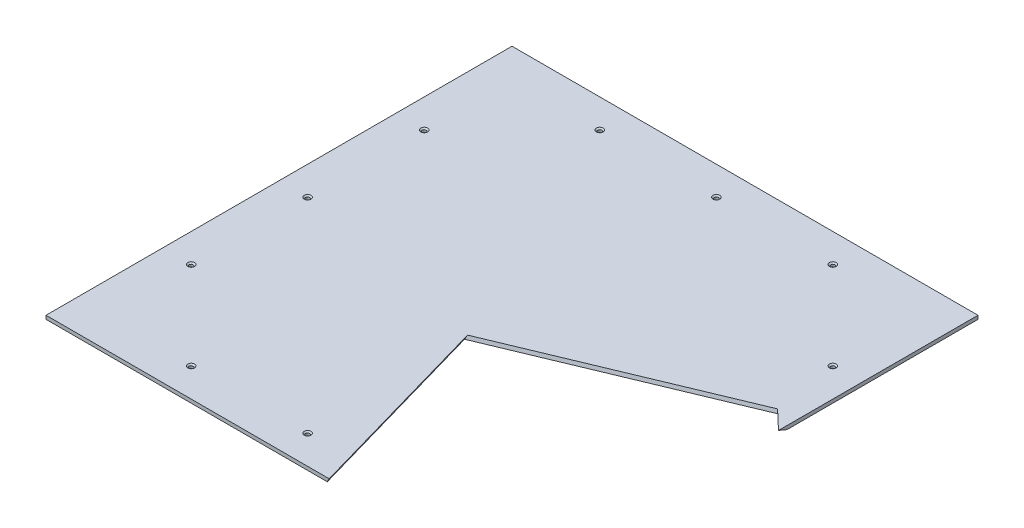
ISO-10303-21;
HEADER;
FILE_DESCRIPTION(('STEP AP214'),'2;1');
FILE_NAME('part.step','',(''),(''),'','','');
FILE_SCHEMA(('AUTOMOTIVE_DESIGN { 1 0 10303 214 1 1 1 1 }'));
ENDSEC;
DATA;
#1=APPLICATION_CONTEXT('core data for automotive mechanical design processes');
#2=APPLICATION_PROTOCOL_DEFINITION('international standard','automotive_design',2000,#1);
#3=PRODUCT_CONTEXT('',#1,'mechanical');
#4=PRODUCT('Part','Part','',(#3));
#5=PRODUCT_RELATED_PRODUCT_CATEGORY('part','',(#4));
#6=PRODUCT_DEFINITION_FORMATION('','',#4);
#7=PRODUCT_DEFINITION_CONTEXT('part definition',#1,'design');
#8=PRODUCT_DEFINITION('design','',#6,#7);
#9=PRODUCT_DEFINITION_SHAPE('','',#8);
#10=(LENGTH_UNIT() NAMED_UNIT(*) SI_UNIT(.MILLI.,.METRE.));
#11=(NAMED_UNIT(*) PLANE_ANGLE_UNIT() SI_UNIT($,.RADIAN.));
#12=(NAMED_UNIT(*) SI_UNIT($,.STERADIAN.) SOLID_ANGLE_UNIT());
#13=UNCERTAINTY_MEASURE_WITH_UNIT(LENGTH_MEASURE(1.E-05),#10,'distance_accuracy_value','');
#14=(GEOMETRIC_REPRESENTATION_CONTEXT(3) GLOBAL_UNCERTAINTY_ASSIGNED_CONTEXT((#13)) GLOBAL_UNIT_ASSIGNED_CONTEXT((#10,
#11,#12)) REPRESENTATION_CONTEXT('',''));
#15=CARTESIAN_POINT('',(0.,0.,0.));
#16=DIRECTION('',(0.,0.,1.));
#17=DIRECTION('',(1.,0.,0.));
#18=AXIS2_PLACEMENT_3D('',#15,#16,#17);
#19=CARTESIAN_POINT('',(103.375714,114.488214,103.375714));
#20=DIRECTION('',(0.,0.,1.));
#21=DIRECTION('',(-1.,0.,0.));
#22=AXIS2_PLACEMENT_3D('',#19,#20,#21);
#23=PLANE('',#22);
#24=DIRECTION('',(-1.,0.,0.));
#25=VECTOR('',#24,1.);
#26=CARTESIAN_POINT('',(103.375714,112.900714,103.375714));
#27=LINE('',#26,#25);
#28=CARTESIAN_POINT('',(21.4309861306069,112.900714,103.375714));
#29=VERTEX_POINT('',#28);
#30=CARTESIAN_POINT('',(-103.375714,112.900714,103.375714));
#31=VERTEX_POINT('',#30);
#32=EDGE_CURVE('E131',#29,#31,#27,.T.);
#33=ORIENTED_EDGE('',*,*,#32,.F.);
#34=DIRECTION('',(0.460037507323201,0.887899482968571,0.));
#35=VECTOR('',#34,1.);
#36=CARTESIAN_POINT('',(39.4217597737779,147.623966695032,103.375714));
#37=LINE('',#36,#35);
#38=CARTESIAN_POINT('',(22.2534998913244,114.488214,103.375714));
#39=VERTEX_POINT('',#38);
#40=EDGE_CURVE('E47',#29,#39,#37,.T.);
#41=ORIENTED_EDGE('',*,*,#40,.T.);
#42=DIRECTION('',(-1.,0.,0.));
#43=VECTOR('',#42,1.);
#44=CARTESIAN_POINT('',(103.375714,114.488214,103.375714));
#45=LINE('',#44,#43);
#46=CARTESIAN_POINT('',(-103.375714,114.488214,103.375714));
#47=VERTEX_POINT('',#46);
#48=EDGE_CURVE('E77',#39,#47,#45,.T.);
#49=ORIENTED_EDGE('',*,*,#48,.T.);
#50=DIRECTION('',(0.,-1.,0.));
#51=VECTOR('',#50,1.);
#52=CARTESIAN_POINT('',(-103.375714,114.488214,103.375714));
#53=LINE('',#52,#51);
#54=EDGE_CURVE('E118',#47,#31,#53,.T.);
#55=ORIENTED_EDGE('',*,*,#54,.T.);
#56=EDGE_LOOP('',(#33,#41,#49,#55));
#57=FACE_BOUND('',#56,.T.);
#58=ADVANCED_FACE('F32',(#57),#23,.T.);
#59=CARTESIAN_POINT('',(103.375714,114.488214,103.375714));
#60=DIRECTION('',(1.,0.,0.));
#61=DIRECTION('',(0.,0.,1.));
#62=AXIS2_PLACEMENT_3D('',#59,#60,#61);
#63=PLANE('',#62);
#64=DIRECTION('',(0.,0.386214206739789,0.922409121004533));
#65=VECTOR('',#64,1.);
#66=CARTESIAN_POINT('',(103.375714,156.608835220611,85.7397410443235));
#67=LINE('',#66,#65);
#68=CARTESIAN_POINT('',(103.375714,112.900714,-18.6499188187758));
#69=VERTEX_POINT('',#68);
#70=CARTESIAN_POINT('',(103.375714,114.488214,-14.8584361284943));
#71=VERTEX_POINT('',#70);
#72=EDGE_CURVE('E224',#69,#71,#67,.T.);
#73=ORIENTED_EDGE('',*,*,#72,.F.);
#74=DIRECTION('',(0.,0.,1.));
#75=VECTOR('',#74,1.);
#76=CARTESIAN_POINT('',(103.375714,112.900714,103.375714));
#77=LINE('',#76,#75);
#78=CARTESIAN_POINT('',(103.375714,112.900714,-103.375714));
#79=VERTEX_POINT('',#78);
#80=EDGE_CURVE('E133',#79,#69,#77,.T.);
#81=ORIENTED_EDGE('',*,*,#80,.F.);
#82=DIRECTION('',(0.,-1.,0.));
#83=VECTOR('',#82,1.);
#84=CARTESIAN_POINT('',(103.375714,114.488214,-103.375714));
#85=LINE('',#84,#83);
#86=CARTESIAN_POINT('',(103.375714,114.488214,-103.375714));
#87=VERTEX_POINT('',#86);
#88=EDGE_CURVE('E56',#87,#79,#85,.T.);
#89=ORIENTED_EDGE('',*,*,#88,.F.);
#90=DIRECTION('',(0.,0.,1.));
#91=VECTOR('',#90,1.);
#92=CARTESIAN_POINT('',(103.375714,114.488214,103.375714));
#93=LINE('',#92,#91);
#94=EDGE_CURVE('E127',#87,#71,#93,.T.);
#95=ORIENTED_EDGE('',*,*,#94,.T.);
#96=EDGE_LOOP('',(#73,#81,#89,#95));
#97=FACE_BOUND('',#96,.T.);
#98=ADVANCED_FACE('F34',(#97),#63,.T.);
#99=CARTESIAN_POINT('',(103.375714,114.488214,-103.375714));
#100=DIRECTION('',(0.,0.,-1.));
#101=DIRECTION('',(1.,0.,0.));
#102=AXIS2_PLACEMENT_3D('',#99,#100,#101);
#103=PLANE('',#102);
#104=DIRECTION('',(1.,0.,0.));
#105=VECTOR('',#104,1.);
#106=CARTESIAN_POINT('',(103.375714,112.900714,-103.375714));
#107=LINE('',#106,#105);
#108=CARTESIAN_POINT('',(-103.375714,112.900714,-103.375714));
#109=VERTEX_POINT('',#108);
#110=EDGE_CURVE('E124',#109,#79,#107,.T.);
#111=ORIENTED_EDGE('',*,*,#110,.F.);
#112=DIRECTION('',(0.,-1.,0.));
#113=VECTOR('',#112,1.);
#114=CARTESIAN_POINT('',(-103.375714,114.488214,-103.375714));
#115=LINE('',#114,#113);
#116=CARTESIAN_POINT('',(-103.375714,114.488214,-103.375714));
#117=VERTEX_POINT('',#116);
#118=EDGE_CURVE('E120',#117,#109,#115,.T.);
#119=ORIENTED_EDGE('',*,*,#118,.F.);
#120=DIRECTION('',(1.,0.,0.));
#121=VECTOR('',#120,1.);
#122=CARTESIAN_POINT('',(103.375714,114.488214,-103.375714));
#123=LINE('',#122,#121);
#124=EDGE_CURVE('E121',#117,#87,#123,.T.);
#125=ORIENTED_EDGE('',*,*,#124,.T.);
#126=ORIENTED_EDGE('',*,*,#88,.T.);
#127=EDGE_LOOP('',(#111,#119,#125,#126));
#128=FACE_BOUND('',#127,.T.);
#129=ADVANCED_FACE('F240',(#128),#103,.T.);
#130=CARTESIAN_POINT('',(-103.375714,114.488214,103.375714));
#131=DIRECTION('',(-1.,0.,0.));
#132=DIRECTION('',(0.,0.,-1.));
#133=AXIS2_PLACEMENT_3D('',#130,#131,#132);
#134=PLANE('',#133);
#135=DIRECTION('',(0.,0.,-1.));
#136=VECTOR('',#135,1.);
#137=CARTESIAN_POINT('',(-103.375714,112.900714,103.375714));
#138=LINE('',#137,#136);
#139=EDGE_CURVE('E128',#31,#109,#138,.T.);
#140=ORIENTED_EDGE('',*,*,#139,.F.);
#141=ORIENTED_EDGE('',*,*,#54,.F.);
#142=DIRECTION('',(0.,0.,-1.));
#143=VECTOR('',#142,1.);
#144=CARTESIAN_POINT('',(-103.375714,114.488214,103.375714));
#145=LINE('',#144,#143);
#146=EDGE_CURVE('E137',#47,#117,#145,.T.);
#147=ORIENTED_EDGE('',*,*,#146,.T.);
#148=ORIENTED_EDGE('',*,*,#118,.T.);
#149=EDGE_LOOP('',(#140,#141,#147,#148));
#150=FACE_BOUND('',#149,.T.);
#151=ADVANCED_FACE('F242',(#150),#134,.T.);
#152=CARTESIAN_POINT('',(103.375714,114.488214,-103.375714));
#153=DIRECTION('',(0.,1.,0.));
#154=DIRECTION('',(0.,0.,-1.));
#155=AXIS2_PLACEMENT_3D('',#152,#153,#154);
#156=PLANE('',#155);
#157=DIRECTION('',(-0.72421998556321,0.,-0.689569004894234));
#158=VECTOR('',#157,1.);
#159=CARTESIAN_POINT('',(59.1702159898484,114.488214,-56.9488808571199));
#160=LINE('',#159,#158);
#161=CARTESIAN_POINT('',(94.8909827444984,114.488214,-22.9372075036051));
#162=VERTEX_POINT('',#161);
#163=EDGE_CURVE('E222',#71,#162,#160,.T.);
#164=ORIENTED_EDGE('',*,*,#163,.F.);
#165=ORIENTED_EDGE('',*,*,#94,.F.);
#166=ORIENTED_EDGE('',*,*,#124,.F.);
#167=ORIENTED_EDGE('',*,*,#146,.F.);
#168=ORIENTED_EDGE('',*,*,#48,.F.);
#169=DIRECTION('',(-0.274341876899344,0.,-0.961632224178945));
#170=VECTOR('',#169,1.);
#171=CARTESIAN_POINT('',(-26.1852936626815,114.488214,-66.4135478813487));
#172=LINE('',#171,#170);
#173=CARTESIAN_POINT('',(-2.24691045077545,114.488214,17.4960650129276));
#174=VERTEX_POINT('',#173);
#175=EDGE_CURVE('E227',#39,#174,#172,.T.);
#176=ORIENTED_EDGE('',*,*,#175,.T.);
#177=DIRECTION('',(-0.923214701144147,0.,0.384284550289657));
#178=VECTOR('',#177,1.);
#179=CARTESIAN_POINT('',(130.660478356849,114.488214,-37.8261217707252));
#180=LINE('',#179,#178);
#181=EDGE_CURVE('E112',#162,#174,#180,.T.);
#182=ORIENTED_EDGE('',*,*,#181,.F.);
#183=EDGE_LOOP('',(#164,#165,#166,#167,#168,#176,#182));
#184=FACE_BOUND('',#183,.T.);
#185=CARTESIAN_POINT('',(-90.6757140000005,114.488214,51.6878569999991));
#186=DIRECTION('',(0.,1.,0.));
#187=DIRECTION('',(0.,0.,-1.));
#188=AXIS2_PLACEMENT_3D('',#185,#186,#187);
#189=CIRCLE('',#188,1.51130000000001);
#190=CARTESIAN_POINT('',(-90.6757140000005,114.488214,50.1765569999991));
#191=VERTEX_POINT('',#190);
#192=EDGE_CURVE('E219',#191,#191,#189,.T.);
#193=ORIENTED_EDGE('',*,*,#192,.F.);
#194=EDGE_LOOP('',(#193));
#195=FACE_BOUND('',#194,.T.);
#196=CARTESIAN_POINT('',(-90.675714,114.488214,-9.36190769008373E-13));
#197=DIRECTION('',(0.,1.,0.));
#198=DIRECTION('',(0.,0.,-1.));
#199=AXIS2_PLACEMENT_3D('',#196,#197,#198);
#200=CIRCLE('',#199,1.51129999999999);
#201=CARTESIAN_POINT('',(-90.675714,114.488214,-1.51130000000093));
#202=VERTEX_POINT('',#201);
#203=EDGE_CURVE('E210',#202,#202,#200,.T.);
#204=ORIENTED_EDGE('',*,*,#203,.F.);
#205=EDGE_LOOP('',(#204));
#206=FACE_BOUND('',#205,.T.);
#207=CARTESIAN_POINT('',(-90.6757139999995,114.488214,-51.687857000001));
#208=DIRECTION('',(0.,1.,0.));
#209=DIRECTION('',(0.,0.,-1.));
#210=AXIS2_PLACEMENT_3D('',#207,#208,#209);
#211=CIRCLE('',#210,1.51129999999999);
#212=CARTESIAN_POINT('',(-90.6757139999995,114.488214,-53.1991570000009));
#213=VERTEX_POINT('',#212);
#214=EDGE_CURVE('E201',#213,#213,#211,.T.);
#215=ORIENTED_EDGE('',*,*,#214,.F.);
#216=EDGE_LOOP('',(#215));
#217=FACE_BOUND('',#216,.T.);
#218=CARTESIAN_POINT('',(-6.1959802232066E-13,114.488214,90.675714));
#219=DIRECTION('',(0.,1.,0.));
#220=DIRECTION('',(0.,0.,-1.));
#221=AXIS2_PLACEMENT_3D('',#218,#219,#220);
#222=CIRCLE('',#221,1.5113);
#223=CARTESIAN_POINT('',(-6.1959802232066E-13,114.488214,89.164414));
#224=VERTEX_POINT('',#223);
#225=EDGE_CURVE('E192',#224,#224,#222,.T.);
#226=ORIENTED_EDGE('',*,*,#225,.F.);
#227=EDGE_LOOP('',(#226));
#228=FACE_BOUND('',#227,.T.);
#229=CARTESIAN_POINT('',(-51.6878570000006,114.488214,90.6757139999997));
#230=DIRECTION('',(0.,1.,0.));
#231=DIRECTION('',(0.,0.,-1.));
#232=AXIS2_PLACEMENT_3D('',#229,#230,#231);
#233=CIRCLE('',#232,1.5113);
#234=CARTESIAN_POINT('',(-51.6878570000006,114.488214,89.1644139999997));
#235=VERTEX_POINT('',#234);
#236=EDGE_CURVE('E183',#235,#235,#233,.T.);
#237=ORIENTED_EDGE('',*,*,#236,.F.);
#238=EDGE_LOOP('',(#237));
#239=FACE_BOUND('',#238,.T.);
#240=CARTESIAN_POINT('',(90.6757140000002,114.488214,-51.6878569999997));
#241=DIRECTION('',(0.,1.,0.));
#242=DIRECTION('',(0.,0.,-1.));
#243=AXIS2_PLACEMENT_3D('',#240,#241,#242);
#244=CIRCLE('',#243,1.51130000000001);
#245=CARTESIAN_POINT('',(90.6757140000002,114.488214,-53.1991569999997));
#246=VERTEX_POINT('',#245);
#247=EDGE_CURVE('E174',#246,#246,#244,.T.);
#248=ORIENTED_EDGE('',*,*,#247,.F.);
#249=EDGE_LOOP('',(#248));
#250=FACE_BOUND('',#249,.T.);
#251=CARTESIAN_POINT('',(-51.687857,114.488214,-90.675714));
#252=DIRECTION('',(0.,1.,0.));
#253=DIRECTION('',(0.,0.,-1.));
#254=AXIS2_PLACEMENT_3D('',#251,#252,#253);
#255=CIRCLE('',#254,1.5113);
#256=CARTESIAN_POINT('',(-51.687857,114.488214,-92.187014));
#257=VERTEX_POINT('',#256);
#258=EDGE_CURVE('E165',#257,#257,#255,.T.);
#259=ORIENTED_EDGE('',*,*,#258,.F.);
#260=EDGE_LOOP('',(#259));
#261=FACE_BOUND('',#260,.T.);
#262=CARTESIAN_POINT('',(0.,114.488214,-90.675714));
#263=DIRECTION('',(0.,1.,0.));
#264=DIRECTION('',(0.,0.,-1.));
#265=AXIS2_PLACEMENT_3D('',#262,#263,#264);
#266=CIRCLE('',#265,1.5113);
#267=CARTESIAN_POINT('',(0.,114.488214,-92.187014));
#268=VERTEX_POINT('',#267);
#269=EDGE_CURVE('E156',#268,#268,#266,.T.);
#270=ORIENTED_EDGE('',*,*,#269,.F.);
#271=EDGE_LOOP('',(#270));
#272=FACE_BOUND('',#271,.T.);
#273=CARTESIAN_POINT('',(51.687857,114.488214,-90.675714));
#274=DIRECTION('',(0.,1.,0.));
#275=DIRECTION('',(0.,0.,-1.));
#276=AXIS2_PLACEMENT_3D('',#273,#274,#275);
#277=CIRCLE('',#276,1.5113);
#278=CARTESIAN_POINT('',(51.687857,114.488214,-92.187014));
#279=VERTEX_POINT('',#278);
#280=EDGE_CURVE('E147',#279,#279,#277,.T.);
#281=ORIENTED_EDGE('',*,*,#280,.F.);
#282=EDGE_LOOP('',(#281));
#283=FACE_BOUND('',#282,.T.);
#284=ADVANCED_FACE('F235',(#184,#195,#206,#217,#228,#239,#250,#261,#272,#283),#156,.T.);
#285=CARTESIAN_POINT('',(103.375714,112.900714,-103.375714));
#286=DIRECTION('',(0.,1.,0.));
#287=DIRECTION('',(0.,0.,-1.));
#288=AXIS2_PLACEMENT_3D('',#285,#286,#287);
#289=PLANE('',#288);
#290=CARTESIAN_POINT('',(-90.6757140000005,112.900714,51.6878569999991));
#291=DIRECTION('',(0.,1.,0.));
#292=DIRECTION('',(0.,0.,-1.));
#293=AXIS2_PLACEMENT_3D('',#290,#291,#292);
#294=CIRCLE('',#293,0.889000000000001);
#295=CARTESIAN_POINT('',(-90.6757140000005,112.900714,50.7988569999991));
#296=VERTEX_POINT('',#295);
#297=EDGE_CURVE('E213',#296,#296,#294,.T.);
#298=ORIENTED_EDGE('',*,*,#297,.T.);
#299=EDGE_LOOP('',(#298));
#300=FACE_BOUND('',#299,.T.);
#301=CARTESIAN_POINT('',(-90.675714,112.900714,-9.36190769008373E-13));
#302=DIRECTION('',(0.,1.,0.));
#303=DIRECTION('',(0.,0.,-1.));
#304=AXIS2_PLACEMENT_3D('',#301,#302,#303);
#305=CIRCLE('',#304,0.889000000000001);
#306=CARTESIAN_POINT('',(-90.675714,112.900714,-0.889000000000937));
#307=VERTEX_POINT('',#306);
#308=EDGE_CURVE('E204',#307,#307,#305,.T.);
#309=ORIENTED_EDGE('',*,*,#308,.T.);
#310=EDGE_LOOP('',(#309));
#311=FACE_BOUND('',#310,.T.);
#312=CARTESIAN_POINT('',(-90.6757139999995,112.900714,-51.687857000001));
#313=DIRECTION('',(0.,1.,0.));
#314=DIRECTION('',(0.,0.,-1.));
#315=AXIS2_PLACEMENT_3D('',#312,#313,#314);
#316=CIRCLE('',#315,0.889000000000001);
#317=CARTESIAN_POINT('',(-90.6757139999995,112.900714,-52.576857000001));
#318=VERTEX_POINT('',#317);
#319=EDGE_CURVE('E195',#318,#318,#316,.T.);
#320=ORIENTED_EDGE('',*,*,#319,.T.);
#321=EDGE_LOOP('',(#320));
#322=FACE_BOUND('',#321,.T.);
#323=CARTESIAN_POINT('',(-6.1959802232066E-13,112.900714,90.675714));
#324=DIRECTION('',(0.,1.,0.));
#325=DIRECTION('',(0.,0.,-1.));
#326=AXIS2_PLACEMENT_3D('',#323,#324,#325);
#327=CIRCLE('',#326,0.889);
#328=CARTESIAN_POINT('',(-6.1959802232066E-13,112.900714,89.786714));
#329=VERTEX_POINT('',#328);
#330=EDGE_CURVE('E186',#329,#329,#327,.T.);
#331=ORIENTED_EDGE('',*,*,#330,.T.);
#332=EDGE_LOOP('',(#331));
#333=FACE_BOUND('',#332,.T.);
#334=CARTESIAN_POINT('',(-51.6878570000006,112.900714,90.6757139999997));
#335=DIRECTION('',(0.,1.,0.));
#336=DIRECTION('',(0.,0.,-1.));
#337=AXIS2_PLACEMENT_3D('',#334,#335,#336);
#338=CIRCLE('',#337,0.889000000000001);
#339=CARTESIAN_POINT('',(-51.6878570000006,112.900714,89.7867139999997));
#340=VERTEX_POINT('',#339);
#341=EDGE_CURVE('E177',#340,#340,#338,.T.);
#342=ORIENTED_EDGE('',*,*,#341,.T.);
#343=EDGE_LOOP('',(#342));
#344=FACE_BOUND('',#343,.T.);
#345=CARTESIAN_POINT('',(90.6757140000002,112.900714,-51.6878569999997));
#346=DIRECTION('',(0.,1.,0.));
#347=DIRECTION('',(0.,0.,-1.));
#348=AXIS2_PLACEMENT_3D('',#345,#346,#347);
#349=CIRCLE('',#348,0.889000000000001);
#350=CARTESIAN_POINT('',(90.6757140000002,112.900714,-52.5768569999997));
#351=VERTEX_POINT('',#350);
#352=EDGE_CURVE('E168',#351,#351,#349,.T.);
#353=ORIENTED_EDGE('',*,*,#352,.T.);
#354=EDGE_LOOP('',(#353));
#355=FACE_BOUND('',#354,.T.);
#356=CARTESIAN_POINT('',(-51.687857,112.900714,-90.675714));
#357=DIRECTION('',(0.,1.,0.));
#358=DIRECTION('',(0.,0.,-1.));
#359=AXIS2_PLACEMENT_3D('',#356,#357,#358);
#360=CIRCLE('',#359,0.889000000000001);
#361=CARTESIAN_POINT('',(-51.687857,112.900714,-91.564714));
#362=VERTEX_POINT('',#361);
#363=EDGE_CURVE('E159',#362,#362,#360,.T.);
#364=ORIENTED_EDGE('',*,*,#363,.T.);
#365=EDGE_LOOP('',(#364));
#366=FACE_BOUND('',#365,.T.);
#367=CARTESIAN_POINT('',(0.,112.900714,-90.675714));
#368=DIRECTION('',(0.,1.,0.));
#369=DIRECTION('',(0.,0.,-1.));
#370=AXIS2_PLACEMENT_3D('',#367,#368,#369);
#371=CIRCLE('',#370,0.889);
#372=CARTESIAN_POINT('',(0.,112.900714,-91.564714));
#373=VERTEX_POINT('',#372);
#374=EDGE_CURVE('E150',#373,#373,#371,.T.);
#375=ORIENTED_EDGE('',*,*,#374,.T.);
#376=EDGE_LOOP('',(#375));
#377=FACE_BOUND('',#376,.T.);
#378=CARTESIAN_POINT('',(51.687857,112.900714,-90.675714));
#379=DIRECTION('',(0.,1.,0.));
#380=DIRECTION('',(0.,0.,-1.));
#381=AXIS2_PLACEMENT_3D('',#378,#379,#380);
#382=CIRCLE('',#381,0.889000000000001);
#383=CARTESIAN_POINT('',(51.687857,112.900714,-91.564714));
#384=VERTEX_POINT('',#383);
#385=EDGE_CURVE('E135',#384,#384,#382,.T.);
#386=ORIENTED_EDGE('',*,*,#385,.T.);
#387=EDGE_LOOP('',(#386));
#388=FACE_BOUND('',#387,.T.);
#389=ORIENTED_EDGE('',*,*,#80,.T.);
#390=DIRECTION('',(-0.72421998556321,0.,-0.689569004894234));
#391=VECTOR('',#390,1.);
#392=CARTESIAN_POINT('',(61.0636811364389,112.900714,-58.9374930067314));
#393=LINE('',#392,#391);
#394=CARTESIAN_POINT('',(97.9549512400548,112.900714,-23.8113201286776));
#395=VERTEX_POINT('',#394);
#396=EDGE_CURVE('E11',#69,#395,#393,.T.);
#397=ORIENTED_EDGE('',*,*,#396,.T.);
#398=DIRECTION('',(-0.923214701144147,0.,0.384284550289657));
#399=VECTOR('',#398,1.);
#400=CARTESIAN_POINT('',(130.80283354399,112.900714,-37.4841241508533));
#401=LINE('',#400,#399);
#402=CARTESIAN_POINT('',(-2.87979663798932,112.900714,18.1607538578641));
#403=VERTEX_POINT('',#402);
#404=EDGE_CURVE('E40',#395,#403,#401,.T.);
#405=ORIENTED_EDGE('',*,*,#404,.T.);
#406=DIRECTION('',(-0.274341876899344,0.,-0.961632224178945));
#407=VECTOR('',#406,1.);
#408=CARTESIAN_POINT('',(-26.9459021874112,112.900714,-66.1965555998784));
#409=LINE('',#408,#407);
#410=EDGE_CURVE('E98',#29,#403,#409,.T.);
#411=ORIENTED_EDGE('',*,*,#410,.F.);
#412=ORIENTED_EDGE('',*,*,#32,.T.);
#413=ORIENTED_EDGE('',*,*,#139,.T.);
#414=ORIENTED_EDGE('',*,*,#110,.T.);
#415=EDGE_LOOP('',(#389,#397,#405,#411,#412,#413,#414));
#416=FACE_BOUND('',#415,.T.);
#417=ADVANCED_FACE('F116',(#300,#311,#322,#333,#344,#355,#366,#377,#388,#416),#289,.F.);
#418=CARTESIAN_POINT('',(51.687857,114.488214,-90.675714));
#419=DIRECTION('',(0.,1.,0.));
#420=DIRECTION('',(0.,0.,-1.));
#421=AXIS2_PLACEMENT_3D('',#418,#419,#420);
#422=CYLINDRICAL_SURFACE('',#421,0.888999999999997);
#423=ORIENTED_EDGE('',*,*,#385,.F.);
#424=EDGE_LOOP('',(#423));
#425=FACE_BOUND('',#424,.T.);
#426=CARTESIAN_POINT('',(51.687857,113.966042299518,-90.675714));
#427=DIRECTION('',(0.,1.,0.));
#428=DIRECTION('',(0.,0.,-1.));
#429=AXIS2_PLACEMENT_3D('',#426,#427,#428);
#430=CIRCLE('',#429,0.888999999999994);
#431=CARTESIAN_POINT('',(51.687857,113.966042299518,-91.564714));
#432=VERTEX_POINT('',#431);
#433=EDGE_CURVE('E144',#432,#432,#430,.T.);
#434=ORIENTED_EDGE('',*,*,#433,.T.);
#435=EDGE_LOOP('',(#434));
#436=FACE_BOUND('',#435,.T.);
#437=ADVANCED_FACE('F256',(#425,#436),#422,.F.);
#438=CARTESIAN_POINT('',(51.687857,114.488214,-90.675714));
#439=DIRECTION('',(0.,1.,0.));
#440=DIRECTION('',(0.,0.,-1.));
#441=AXIS2_PLACEMENT_3D('',#438,#439,#440);
#442=CONICAL_SURFACE('',#441,1.5113,0.872664625997172);
#443=ORIENTED_EDGE('',*,*,#433,.F.);
#444=EDGE_LOOP('',(#443));
#445=FACE_BOUND('',#444,.T.);
#446=ORIENTED_EDGE('',*,*,#280,.T.);
#447=EDGE_LOOP('',(#446));
#448=FACE_BOUND('',#447,.T.);
#449=ADVANCED_FACE('F262',(#445,#448),#442,.F.);
#450=CARTESIAN_POINT('',(0.,114.488214,-90.675714));
#451=DIRECTION('',(0.,1.,0.));
#452=DIRECTION('',(0.,0.,-1.));
#453=AXIS2_PLACEMENT_3D('',#450,#451,#452);
#454=CYLINDRICAL_SURFACE('',#453,0.888999999999998);
#455=ORIENTED_EDGE('',*,*,#374,.F.);
#456=EDGE_LOOP('',(#455));
#457=FACE_BOUND('',#456,.T.);
#458=CARTESIAN_POINT('',(0.,113.966042299518,-90.675714));
#459=DIRECTION('',(0.,1.,0.));
#460=DIRECTION('',(0.,0.,-1.));
#461=AXIS2_PLACEMENT_3D('',#458,#459,#460);
#462=CIRCLE('',#461,0.888999999999997);
#463=CARTESIAN_POINT('',(0.,113.966042299518,-91.564714));
#464=VERTEX_POINT('',#463);
#465=EDGE_CURVE('E153',#464,#464,#462,.T.);
#466=ORIENTED_EDGE('',*,*,#465,.T.);
#467=EDGE_LOOP('',(#466));
#468=FACE_BOUND('',#467,.T.);
#469=ADVANCED_FACE('F266',(#457,#468),#454,.F.);
#470=CARTESIAN_POINT('',(0.,114.488214,-90.675714));
#471=DIRECTION('',(0.,1.,0.));
#472=DIRECTION('',(0.,0.,-1.));
#473=AXIS2_PLACEMENT_3D('',#470,#471,#472);
#474=CONICAL_SURFACE('',#473,1.5113,0.87266462599717);
#475=ORIENTED_EDGE('',*,*,#465,.F.);
#476=EDGE_LOOP('',(#475));
#477=FACE_BOUND('',#476,.T.);
#478=ORIENTED_EDGE('',*,*,#269,.T.);
#479=EDGE_LOOP('',(#478));
#480=FACE_BOUND('',#479,.T.);
#481=ADVANCED_FACE('F270',(#477,#480),#474,.F.);
#482=CARTESIAN_POINT('',(-51.687857,114.488214,-90.675714));
#483=DIRECTION('',(0.,1.,0.));
#484=DIRECTION('',(0.,0.,-1.));
#485=AXIS2_PLACEMENT_3D('',#482,#483,#484);
#486=CYLINDRICAL_SURFACE('',#485,0.888999999999997);
#487=ORIENTED_EDGE('',*,*,#363,.F.);
#488=EDGE_LOOP('',(#487));
#489=FACE_BOUND('',#488,.T.);
#490=CARTESIAN_POINT('',(-51.687857,113.966042299518,-90.675714));
#491=DIRECTION('',(0.,1.,0.));
#492=DIRECTION('',(0.,0.,-1.));
#493=AXIS2_PLACEMENT_3D('',#490,#491,#492);
#494=CIRCLE('',#493,0.888999999999994);
#495=CARTESIAN_POINT('',(-51.687857,113.966042299518,-91.564714));
#496=VERTEX_POINT('',#495);
#497=EDGE_CURVE('E162',#496,#496,#494,.T.);
#498=ORIENTED_EDGE('',*,*,#497,.T.);
#499=EDGE_LOOP('',(#498));
#500=FACE_BOUND('',#499,.T.);
#501=ADVANCED_FACE('F274',(#489,#500),#486,.F.);
#502=CARTESIAN_POINT('',(-51.687857,114.488214,-90.675714));
#503=DIRECTION('',(0.,1.,0.));
#504=DIRECTION('',(0.,0.,-1.));
#505=AXIS2_PLACEMENT_3D('',#502,#503,#504);
#506=CONICAL_SURFACE('',#505,1.5113,0.872664625997172);
#507=ORIENTED_EDGE('',*,*,#497,.F.);
#508=EDGE_LOOP('',(#507));
#509=FACE_BOUND('',#508,.T.);
#510=ORIENTED_EDGE('',*,*,#258,.T.);
#511=EDGE_LOOP('',(#510));
#512=FACE_BOUND('',#511,.T.);
#513=ADVANCED_FACE('F278',(#509,#512),#506,.F.);
#514=CARTESIAN_POINT('',(90.6757140000002,114.488214,-51.6878569999997));
#515=DIRECTION('',(0.,1.,0.));
#516=DIRECTION('',(0.,0.,-1.));
#517=AXIS2_PLACEMENT_3D('',#514,#515,#516);
#518=CYLINDRICAL_SURFACE('',#517,0.889000000000001);
#519=ORIENTED_EDGE('',*,*,#352,.F.);
#520=EDGE_LOOP('',(#519));
#521=FACE_BOUND('',#520,.T.);
#522=CARTESIAN_POINT('',(90.6757140000002,113.966042299518,-51.6878569999997));
#523=DIRECTION('',(0.,1.,0.));
#524=DIRECTION('',(0.,0.,-1.));
#525=AXIS2_PLACEMENT_3D('',#522,#523,#524);
#526=CIRCLE('',#525,0.889000000000001);
#527=CARTESIAN_POINT('',(90.6757140000002,113.966042299518,-52.5768569999997));
#528=VERTEX_POINT('',#527);
#529=EDGE_CURVE('E171',#528,#528,#526,.T.);
#530=ORIENTED_EDGE('',*,*,#529,.T.);
#531=EDGE_LOOP('',(#530));
#532=FACE_BOUND('',#531,.T.);
#533=ADVANCED_FACE('F282',(#521,#532),#518,.F.);
#534=CARTESIAN_POINT('',(90.6757140000002,114.488214,-51.6878569999997));
#535=DIRECTION('',(0.,1.,0.));
#536=DIRECTION('',(0.,0.,-1.));
#537=AXIS2_PLACEMENT_3D('',#534,#535,#536);
#538=CONICAL_SURFACE('',#537,1.51130000000001,0.872664625997172);
#539=ORIENTED_EDGE('',*,*,#529,.F.);
#540=EDGE_LOOP('',(#539));
#541=FACE_BOUND('',#540,.T.);
#542=ORIENTED_EDGE('',*,*,#247,.T.);
#543=EDGE_LOOP('',(#542));
#544=FACE_BOUND('',#543,.T.);
#545=ADVANCED_FACE('F286',(#541,#544),#538,.F.);
#546=CARTESIAN_POINT('',(-51.6878570000006,114.488214,90.6757139999997));
#547=DIRECTION('',(0.,1.,0.));
#548=DIRECTION('',(0.,0.,-1.));
#549=AXIS2_PLACEMENT_3D('',#546,#547,#548);
#550=CYLINDRICAL_SURFACE('',#549,0.888999999999997);
#551=ORIENTED_EDGE('',*,*,#341,.F.);
#552=EDGE_LOOP('',(#551));
#553=FACE_BOUND('',#552,.T.);
#554=CARTESIAN_POINT('',(-51.6878570000006,113.966042299518,90.6757139999997));
#555=DIRECTION('',(0.,1.,0.));
#556=DIRECTION('',(0.,0.,-1.));
#557=AXIS2_PLACEMENT_3D('',#554,#555,#556);
#558=CIRCLE('',#557,0.888999999999994);
#559=CARTESIAN_POINT('',(-51.6878570000006,113.966042299518,89.7867139999997));
#560=VERTEX_POINT('',#559);
#561=EDGE_CURVE('E180',#560,#560,#558,.T.);
#562=ORIENTED_EDGE('',*,*,#561,.T.);
#563=EDGE_LOOP('',(#562));
#564=FACE_BOUND('',#563,.T.);
#565=ADVANCED_FACE('F290',(#553,#564),#550,.F.);
#566=CARTESIAN_POINT('',(-51.6878570000006,114.488214,90.6757139999997));
#567=DIRECTION('',(0.,1.,0.));
#568=DIRECTION('',(0.,0.,-1.));
#569=AXIS2_PLACEMENT_3D('',#566,#567,#568);
#570=CONICAL_SURFACE('',#569,1.5113,0.872664625997172);
#571=ORIENTED_EDGE('',*,*,#561,.F.);
#572=EDGE_LOOP('',(#571));
#573=FACE_BOUND('',#572,.T.);
#574=ORIENTED_EDGE('',*,*,#236,.T.);
#575=EDGE_LOOP('',(#574));
#576=FACE_BOUND('',#575,.T.);
#577=ADVANCED_FACE('F294',(#573,#576),#570,.F.);
#578=CARTESIAN_POINT('',(-6.1959802232066E-13,114.488214,90.675714));
#579=DIRECTION('',(0.,1.,0.));
#580=DIRECTION('',(0.,0.,-1.));
#581=AXIS2_PLACEMENT_3D('',#578,#579,#580);
#582=CYLINDRICAL_SURFACE('',#581,0.888999999999998);
#583=ORIENTED_EDGE('',*,*,#330,.F.);
#584=EDGE_LOOP('',(#583));
#585=FACE_BOUND('',#584,.T.);
#586=CARTESIAN_POINT('',(-6.1959802232066E-13,113.966042299518,90.675714));
#587=DIRECTION('',(0.,1.,0.));
#588=DIRECTION('',(0.,0.,-1.));
#589=AXIS2_PLACEMENT_3D('',#586,#587,#588);
#590=CIRCLE('',#589,0.888999999999997);
#591=CARTESIAN_POINT('',(-6.1959802232066E-13,113.966042299518,89.786714));
#592=VERTEX_POINT('',#591);
#593=EDGE_CURVE('E189',#592,#592,#590,.T.);
#594=ORIENTED_EDGE('',*,*,#593,.T.);
#595=EDGE_LOOP('',(#594));
#596=FACE_BOUND('',#595,.T.);
#597=ADVANCED_FACE('F298',(#585,#596),#582,.F.);
#598=CARTESIAN_POINT('',(-6.1959802232066E-13,114.488214,90.675714));
#599=DIRECTION('',(0.,1.,0.));
#600=DIRECTION('',(0.,0.,-1.));
#601=AXIS2_PLACEMENT_3D('',#598,#599,#600);
#602=CONICAL_SURFACE('',#601,1.5113,0.87266462599717);
#603=ORIENTED_EDGE('',*,*,#593,.F.);
#604=EDGE_LOOP('',(#603));
#605=FACE_BOUND('',#604,.T.);
#606=ORIENTED_EDGE('',*,*,#225,.T.);
#607=EDGE_LOOP('',(#606));
#608=FACE_BOUND('',#607,.T.);
#609=ADVANCED_FACE('F302',(#605,#608),#602,.F.);
#610=CARTESIAN_POINT('',(-90.6757139999995,114.488214,-51.687857000001));
#611=DIRECTION('',(0.,1.,0.));
#612=DIRECTION('',(0.,0.,-1.));
#613=AXIS2_PLACEMENT_3D('',#610,#611,#612);
#614=CYLINDRICAL_SURFACE('',#613,0.889000000000001);
#615=ORIENTED_EDGE('',*,*,#319,.F.);
#616=EDGE_LOOP('',(#615));
#617=FACE_BOUND('',#616,.T.);
#618=CARTESIAN_POINT('',(-90.6757139999995,113.966042299518,-51.687857000001));
#619=DIRECTION('',(0.,1.,0.));
#620=DIRECTION('',(0.,0.,-1.));
#621=AXIS2_PLACEMENT_3D('',#618,#619,#620);
#622=CIRCLE('',#621,0.889000000000001);
#623=CARTESIAN_POINT('',(-90.6757139999995,113.966042299518,-52.576857000001));
#624=VERTEX_POINT('',#623);
#625=EDGE_CURVE('E198',#624,#624,#622,.T.);
#626=ORIENTED_EDGE('',*,*,#625,.T.);
#627=EDGE_LOOP('',(#626));
#628=FACE_BOUND('',#627,.T.);
#629=ADVANCED_FACE('F306',(#617,#628),#614,.F.);
#630=CARTESIAN_POINT('',(-90.6757139999995,114.488214,-51.687857000001));
#631=DIRECTION('',(0.,1.,0.));
#632=DIRECTION('',(0.,0.,-1.));
#633=AXIS2_PLACEMENT_3D('',#630,#631,#632);
#634=CONICAL_SURFACE('',#633,1.51129999999999,0.872664625997161);
#635=ORIENTED_EDGE('',*,*,#625,.F.);
#636=EDGE_LOOP('',(#635));
#637=FACE_BOUND('',#636,.T.);
#638=ORIENTED_EDGE('',*,*,#214,.T.);
#639=EDGE_LOOP('',(#638));
#640=FACE_BOUND('',#639,.T.);
#641=ADVANCED_FACE('F310',(#637,#640),#634,.F.);
#642=CARTESIAN_POINT('',(-90.675714,114.488214,-9.36190769008373E-13));
#643=DIRECTION('',(0.,1.,0.));
#644=DIRECTION('',(0.,0.,-1.));
#645=AXIS2_PLACEMENT_3D('',#642,#643,#644);
#646=CYLINDRICAL_SURFACE('',#645,0.889000000000001);
#647=ORIENTED_EDGE('',*,*,#308,.F.);
#648=EDGE_LOOP('',(#647));
#649=FACE_BOUND('',#648,.T.);
#650=CARTESIAN_POINT('',(-90.675714,113.966042299518,-9.36190769008373E-13));
#651=DIRECTION('',(0.,1.,0.));
#652=DIRECTION('',(0.,0.,-1.));
#653=AXIS2_PLACEMENT_3D('',#650,#651,#652);
#654=CIRCLE('',#653,0.889000000000001);
#655=CARTESIAN_POINT('',(-90.675714,113.966042299518,-0.889000000000937));
#656=VERTEX_POINT('',#655);
#657=EDGE_CURVE('E207',#656,#656,#654,.T.);
#658=ORIENTED_EDGE('',*,*,#657,.T.);
#659=EDGE_LOOP('',(#658));
#660=FACE_BOUND('',#659,.T.);
#661=ADVANCED_FACE('F314',(#649,#660),#646,.F.);
#662=CARTESIAN_POINT('',(-90.675714,114.488214,-9.36190769008373E-13));
#663=DIRECTION('',(0.,1.,0.));
#664=DIRECTION('',(0.,0.,-1.));
#665=AXIS2_PLACEMENT_3D('',#662,#663,#664);
#666=CONICAL_SURFACE('',#665,1.51129999999999,0.872664625997161);
#667=ORIENTED_EDGE('',*,*,#657,.F.);
#668=EDGE_LOOP('',(#667));
#669=FACE_BOUND('',#668,.T.);
#670=ORIENTED_EDGE('',*,*,#203,.T.);
#671=EDGE_LOOP('',(#670));
#672=FACE_BOUND('',#671,.T.);
#673=ADVANCED_FACE('F318',(#669,#672),#666,.F.);
#674=CARTESIAN_POINT('',(-90.6757140000005,114.488214,51.6878569999991));
#675=DIRECTION('',(0.,1.,0.));
#676=DIRECTION('',(0.,0.,-1.));
#677=AXIS2_PLACEMENT_3D('',#674,#675,#676);
#678=CYLINDRICAL_SURFACE('',#677,0.889000000000001);
#679=ORIENTED_EDGE('',*,*,#297,.F.);
#680=EDGE_LOOP('',(#679));
#681=FACE_BOUND('',#680,.T.);
#682=CARTESIAN_POINT('',(-90.6757140000005,113.966042299518,51.6878569999991));
#683=DIRECTION('',(0.,1.,0.));
#684=DIRECTION('',(0.,0.,-1.));
#685=AXIS2_PLACEMENT_3D('',#682,#683,#684);
#686=CIRCLE('',#685,0.889000000000001);
#687=CARTESIAN_POINT('',(-90.6757140000005,113.966042299518,50.7988569999991));
#688=VERTEX_POINT('',#687);
#689=EDGE_CURVE('E216',#688,#688,#686,.T.);
#690=ORIENTED_EDGE('',*,*,#689,.T.);
#691=EDGE_LOOP('',(#690));
#692=FACE_BOUND('',#691,.T.);
#693=ADVANCED_FACE('F322',(#681,#692),#678,.F.);
#694=CARTESIAN_POINT('',(-90.6757140000005,114.488214,51.6878569999991));
#695=DIRECTION('',(0.,1.,0.));
#696=DIRECTION('',(0.,0.,-1.));
#697=AXIS2_PLACEMENT_3D('',#694,#695,#696);
#698=CONICAL_SURFACE('',#697,1.51130000000001,0.872664625997172);
#699=ORIENTED_EDGE('',*,*,#689,.F.);
#700=EDGE_LOOP('',(#699));
#701=FACE_BOUND('',#700,.T.);
#702=ORIENTED_EDGE('',*,*,#192,.T.);
#703=EDGE_LOOP('',(#702));
#704=FACE_BOUND('',#703,.T.);
#705=ADVANCED_FACE('F326',(#701,#704),#698,.F.);
#706=CARTESIAN_POINT('',(-51.1988767971413,-8.30044554866632,68.9078774769947));
#707=DIRECTION('',(-0.374230803028497,-0.227244429015719,-0.899061330247256));
#708=DIRECTION('',(-0.923214701144147,0.,0.384284550289657));
#709=AXIS2_PLACEMENT_3D('',#706,#707,#708);
#710=PLANE('',#709);
#711=ORIENTED_EDGE('',*,*,#181,.T.);
#712=DIRECTION('',(0.345138706889568,0.865728638508028,-0.362481996068263));
#713=VECTOR('',#712,1.);
#714=CARTESIAN_POINT('',(-51.1988767971413,-8.30044554866632,68.9078774769947));
#715=LINE('',#714,#713);
#716=EDGE_CURVE('E101',#403,#174,#715,.T.);
#717=ORIENTED_EDGE('',*,*,#716,.F.);
#718=ORIENTED_EDGE('',*,*,#404,.F.);
#719=DIRECTION('',(0.860715155595185,-0.445952793407951,-0.245551475215283));
#720=VECTOR('',#719,1.);
#721=CARTESIAN_POINT('',(14.3826939382926,156.201080390501,0.0308196711362174));
#722=LINE('',#721,#720);
#723=EDGE_CURVE('E113',#162,#395,#722,.T.);
#724=ORIENTED_EDGE('',*,*,#723,.F.);
#725=EDGE_LOOP('',(#711,#717,#718,#724));
#726=FACE_BOUND('',#725,.T.);
#727=ADVANCED_FACE('F108',(#726),#710,.F.);
#728=CARTESIAN_POINT('',(14.3826939382926,156.201080390501,0.0308196711362174));
#729=DIRECTION('',(0.345138706889568,0.865728638508028,-0.362481996068263));
#730=DIRECTION('',(0.,0.386214206739789,0.922409121004533));
#731=AXIS2_PLACEMENT_3D('',#728,#729,#730);
#732=PLANE('',#731);
#733=ORIENTED_EDGE('',*,*,#163,.T.);
#734=ORIENTED_EDGE('',*,*,#723,.T.);
#735=ORIENTED_EDGE('',*,*,#396,.F.);
#736=ORIENTED_EDGE('',*,*,#72,.T.);
#737=EDGE_LOOP('',(#733,#734,#735,#736));
#738=FACE_BOUND('',#737,.T.);
#739=ADVANCED_FACE('F231',(#738),#732,.F.);
#740=CARTESIAN_POINT('',(-51.1988767971413,-8.30044554866632,68.9078774769947));
#741=DIRECTION('',(0.860715155595185,-0.445952793407951,-0.245551475215283));
#742=DIRECTION('',(0.460037507323201,0.887899482968571,0.));
#743=AXIS2_PLACEMENT_3D('',#740,#741,#742);
#744=PLANE('',#743);
#745=ORIENTED_EDGE('',*,*,#40,.F.);
#746=ORIENTED_EDGE('',*,*,#410,.T.);
#747=ORIENTED_EDGE('',*,*,#716,.T.);
#748=ORIENTED_EDGE('',*,*,#175,.F.);
#749=EDGE_LOOP('',(#745,#746,#747,#748));
#750=FACE_BOUND('',#749,.T.);
#751=ADVANCED_FACE('F100',(#750),#744,.T.);
#752=CLOSED_SHELL('',(#58,#98,#129,#151,#284,#417,#437,#449,#469,#481,#501,#513,#533,#545,#565,
#577,#597,#609,#629,#641,#661,#673,#693,#705,#727,#739,#751));
#753=MANIFOLD_SOLID_BREP('B2',#752);
#754=ADVANCED_BREP_SHAPE_REPRESENTATION('',(#18,#753),#14);
#755=SHAPE_DEFINITION_REPRESENTATION(#9,#754);
ENDSEC;
END-ISO-10303-21;
